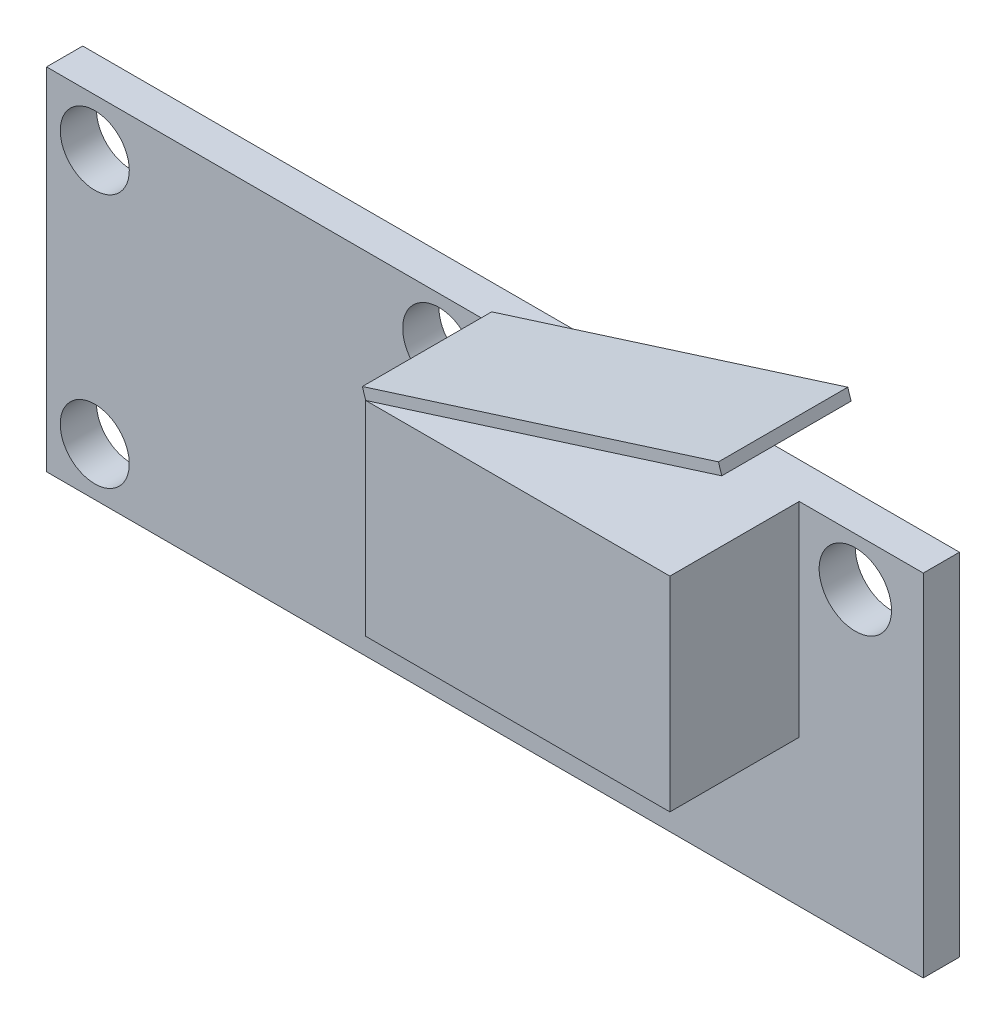
ISO-10303-21;
HEADER;
FILE_DESCRIPTION(('STEP AP214'),'2;1');
FILE_NAME('part.step','',(''),(''),'','','');
FILE_SCHEMA(('AUTOMOTIVE_DESIGN { 1 0 10303 214 1 1 1 1 }'));
ENDSEC;
DATA;
#1=APPLICATION_CONTEXT('core data for automotive mechanical design processes');
#2=APPLICATION_PROTOCOL_DEFINITION('international standard','automotive_design',2000,#1);
#3=PRODUCT_CONTEXT('',#1,'mechanical');
#4=PRODUCT('Part','Part','',(#3));
#5=PRODUCT_RELATED_PRODUCT_CATEGORY('part','',(#4));
#6=PRODUCT_DEFINITION_FORMATION('','',#4);
#7=PRODUCT_DEFINITION_CONTEXT('part definition',#1,'design');
#8=PRODUCT_DEFINITION('design','',#6,#7);
#9=PRODUCT_DEFINITION_SHAPE('','',#8);
#10=(LENGTH_UNIT() NAMED_UNIT(*) SI_UNIT(.MILLI.,.METRE.));
#11=(NAMED_UNIT(*) PLANE_ANGLE_UNIT() SI_UNIT($,.RADIAN.));
#12=(NAMED_UNIT(*) SI_UNIT($,.STERADIAN.) SOLID_ANGLE_UNIT());
#13=UNCERTAINTY_MEASURE_WITH_UNIT(LENGTH_MEASURE(1.E-05),#10,'distance_accuracy_value','');
#14=(GEOMETRIC_REPRESENTATION_CONTEXT(3) GLOBAL_UNCERTAINTY_ASSIGNED_CONTEXT((#13)) GLOBAL_UNIT_ASSIGNED_CONTEXT((#10,
#11,#12)) REPRESENTATION_CONTEXT('',''));
#15=CARTESIAN_POINT('',(0.,0.,0.));
#16=DIRECTION('',(0.,0.,1.));
#17=DIRECTION('',(1.,0.,0.));
#18=AXIS2_PLACEMENT_3D('',#15,#16,#17);
#19=CARTESIAN_POINT('',(20.4601752268349,16.,7.55));
#20=DIRECTION('',(-0.30191381405239,0.953335223771963,0.));
#21=DIRECTION('',(-0.953335223771963,-0.30191381405239,0.));
#22=AXIS2_PLACEMENT_3D('',#19,#20,#21);
#23=PLANE('',#22);
#24=DIRECTION('',(0.953335223771963,0.30191381405239,0.));
#25=VECTOR('',#24,1.);
#26=CARTESIAN_POINT('',(20.4601752268349,16.,1.65));
#27=LINE('',#26,#25);
#28=CARTESIAN_POINT('',(20.4601752268349,16.,1.65));
#29=VERTEX_POINT('',#28);
#30=CARTESIAN_POINT('',(36.706382378916,21.1450468238896,1.65));
#31=VERTEX_POINT('',#30);
#32=EDGE_CURVE('E106',#29,#31,#27,.T.);
#33=ORIENTED_EDGE('',*,*,#32,.T.);
#34=DIRECTION('',(0.,0.,-1.));
#35=VECTOR('',#34,1.);
#36=CARTESIAN_POINT('',(36.706382378916,21.1450468238896,7.55));
#37=LINE('',#36,#35);
#38=CARTESIAN_POINT('',(36.706382378916,21.1450468238896,7.55));
#39=VERTEX_POINT('',#38);
#40=EDGE_CURVE('E12',#39,#31,#37,.T.);
#41=ORIENTED_EDGE('',*,*,#40,.F.);
#42=DIRECTION('',(0.953335223771963,0.30191381405239,0.));
#43=VECTOR('',#42,1.);
#44=CARTESIAN_POINT('',(20.4601752268349,16.,7.55));
#45=LINE('',#44,#43);
#46=CARTESIAN_POINT('',(20.4601752268349,16.,7.55));
#47=VERTEX_POINT('',#46);
#48=EDGE_CURVE('E83',#47,#39,#45,.T.);
#49=ORIENTED_EDGE('',*,*,#48,.F.);
#50=DIRECTION('',(0.,0.,-1.));
#51=VECTOR('',#50,1.);
#52=CARTESIAN_POINT('',(20.4601752268349,16.,7.55));
#53=LINE('',#52,#51);
#54=EDGE_CURVE('E59',#47,#29,#53,.T.);
#55=ORIENTED_EDGE('',*,*,#54,.T.);
#56=EDGE_LOOP('',(#33,#41,#49,#55));
#57=FACE_BOUND('',#56,.T.);
#58=ADVANCED_FACE('F43',(#57),#23,.F.);
#59=CARTESIAN_POINT('',(36.5554254718899,21.6217144357756,7.55));
#60=DIRECTION('',(0.953335223771966,0.301913814052382,0.));
#61=DIRECTION('',(-0.301913814052382,0.953335223771966,0.));
#62=AXIS2_PLACEMENT_3D('',#59,#60,#61);
#63=PLANE('',#62);
#64=DIRECTION('',(0.301913814052382,-0.953335223771966,0.));
#65=VECTOR('',#64,1.);
#66=CARTESIAN_POINT('',(36.5554254718899,21.6217144357756,1.65));
#67=LINE('',#66,#65);
#68=CARTESIAN_POINT('',(36.5554254718899,21.6217144357756,1.65));
#69=VERTEX_POINT('',#68);
#70=EDGE_CURVE('E92',#69,#31,#67,.T.);
#71=ORIENTED_EDGE('',*,*,#70,.F.);
#72=DIRECTION('',(0.,0.,-1.));
#73=VECTOR('',#72,1.);
#74=CARTESIAN_POINT('',(36.5554254718899,21.6217144357756,7.55));
#75=LINE('',#74,#73);
#76=CARTESIAN_POINT('',(36.5554254718899,21.6217144357756,7.55));
#77=VERTEX_POINT('',#76);
#78=EDGE_CURVE('E51',#77,#69,#75,.T.);
#79=ORIENTED_EDGE('',*,*,#78,.F.);
#80=DIRECTION('',(0.301913814052382,-0.953335223771966,0.));
#81=VECTOR('',#80,1.);
#82=CARTESIAN_POINT('',(36.5554254718899,21.6217144357756,7.55));
#83=LINE('',#82,#81);
#84=EDGE_CURVE('E90',#77,#39,#83,.T.);
#85=ORIENTED_EDGE('',*,*,#84,.T.);
#86=ORIENTED_EDGE('',*,*,#40,.T.);
#87=EDGE_LOOP('',(#71,#79,#85,#86));
#88=FACE_BOUND('',#87,.T.);
#89=ADVANCED_FACE('F89',(#88),#63,.T.);
#90=CARTESIAN_POINT('',(20.3092183198087,16.476667611886,7.55));
#91=DIRECTION('',(-0.30191381405239,0.953335223771963,0.));
#92=DIRECTION('',(-0.953335223771963,-0.30191381405239,0.));
#93=AXIS2_PLACEMENT_3D('',#90,#91,#92);
#94=PLANE('',#93);
#95=DIRECTION('',(0.953335223771963,0.30191381405239,0.));
#96=VECTOR('',#95,1.);
#97=CARTESIAN_POINT('',(20.3092183198087,16.476667611886,1.65));
#98=LINE('',#97,#96);
#99=CARTESIAN_POINT('',(20.3092183198087,16.476667611886,1.65));
#100=VERTEX_POINT('',#99);
#101=EDGE_CURVE('E109',#100,#69,#98,.T.);
#102=ORIENTED_EDGE('',*,*,#101,.F.);
#103=DIRECTION('',(0.,0.,-1.));
#104=VECTOR('',#103,1.);
#105=CARTESIAN_POINT('',(20.3092183198087,16.476667611886,7.55));
#106=LINE('',#105,#104);
#107=CARTESIAN_POINT('',(20.3092183198087,16.476667611886,7.55));
#108=VERTEX_POINT('',#107);
#109=EDGE_CURVE('E72',#108,#100,#106,.T.);
#110=ORIENTED_EDGE('',*,*,#109,.F.);
#111=DIRECTION('',(0.953335223771963,0.30191381405239,0.));
#112=VECTOR('',#111,1.);
#113=CARTESIAN_POINT('',(20.3092183198087,16.476667611886,7.55));
#114=LINE('',#113,#112);
#115=EDGE_CURVE('E98',#108,#77,#114,.T.);
#116=ORIENTED_EDGE('',*,*,#115,.T.);
#117=ORIENTED_EDGE('',*,*,#78,.T.);
#118=EDGE_LOOP('',(#102,#110,#116,#117));
#119=FACE_BOUND('',#118,.T.);
#120=ADVANCED_FACE('F100',(#119),#94,.T.);
#121=CARTESIAN_POINT('',(20.4601752268349,16.,7.55));
#122=DIRECTION('',(-0.953335223771964,-0.301913814052388,0.));
#123=DIRECTION('',(0.301913814052388,-0.953335223771964,0.));
#124=AXIS2_PLACEMENT_3D('',#121,#122,#123);
#125=PLANE('',#124);
#126=DIRECTION('',(-0.301913814052388,0.953335223771964,0.));
#127=VECTOR('',#126,1.);
#128=CARTESIAN_POINT('',(20.4601752268349,16.,1.65));
#129=LINE('',#128,#127);
#130=EDGE_CURVE('E111',#29,#100,#129,.T.);
#131=ORIENTED_EDGE('',*,*,#130,.F.);
#132=ORIENTED_EDGE('',*,*,#54,.F.);
#133=DIRECTION('',(-0.301913814052388,0.953335223771964,0.));
#134=VECTOR('',#133,1.);
#135=CARTESIAN_POINT('',(20.4601752268349,16.,7.55));
#136=LINE('',#135,#134);
#137=EDGE_CURVE('E101',#47,#108,#136,.T.);
#138=ORIENTED_EDGE('',*,*,#137,.T.);
#139=ORIENTED_EDGE('',*,*,#109,.T.);
#140=EDGE_LOOP('',(#131,#132,#138,#139));
#141=FACE_BOUND('',#140,.T.);
#142=ADVANCED_FACE('F117',(#141),#125,.T.);
#143=CARTESIAN_POINT('',(0.,0.,7.55));
#144=DIRECTION('',(0.,0.,-1.));
#145=DIRECTION('',(-1.,0.,0.));
#146=AXIS2_PLACEMENT_3D('',#143,#144,#145);
#147=PLANE('',#146);
#148=ORIENTED_EDGE('',*,*,#48,.T.);
#149=ORIENTED_EDGE('',*,*,#84,.F.);
#150=ORIENTED_EDGE('',*,*,#115,.F.);
#151=ORIENTED_EDGE('',*,*,#137,.F.);
#152=EDGE_LOOP('',(#148,#149,#150,#151));
#153=FACE_BOUND('',#152,.T.);
#154=ADVANCED_FACE('F97',(#153),#147,.F.);
#155=CARTESIAN_POINT('',(0.,0.,1.65));
#156=DIRECTION('',(0.,0.,-1.));
#157=DIRECTION('',(-1.,0.,0.));
#158=AXIS2_PLACEMENT_3D('',#155,#156,#157);
#159=PLANE('',#158);
#160=ORIENTED_EDGE('',*,*,#32,.F.);
#161=ORIENTED_EDGE('',*,*,#130,.T.);
#162=ORIENTED_EDGE('',*,*,#101,.T.);
#163=ORIENTED_EDGE('',*,*,#70,.T.);
#164=EDGE_LOOP('',(#160,#161,#162,#163));
#165=FACE_BOUND('',#164,.T.);
#166=ADVANCED_FACE('F116',(#165),#159,.T.);
#167=CLOSED_SHELL('',(#58,#89,#120,#142,#154,#166));
#168=MANIFOLD_SOLID_BREP('B2',#167);
#169=CARTESIAN_POINT('',(0.,0.,1.65));
#170=DIRECTION('',(0.,0.,-1.));
#171=DIRECTION('',(-1.,0.,0.));
#172=AXIS2_PLACEMENT_3D('',#169,#170,#171);
#173=PLANE('',#172);
#174=CARTESIAN_POINT('',(2.2,2.2,1.65));
#175=DIRECTION('',(0.,0.,1.));
#176=DIRECTION('',(-1.,0.,0.));
#177=AXIS2_PLACEMENT_3D('',#174,#175,#176);
#178=CIRCLE('',#177,1.575);
#179=CARTESIAN_POINT('',(0.625000000000001,2.2,1.65));
#180=VERTEX_POINT('',#179);
#181=EDGE_CURVE('E257',#180,#180,#178,.T.);
#182=ORIENTED_EDGE('',*,*,#181,.F.);
#183=EDGE_LOOP('',(#182));
#184=FACE_BOUND('',#183,.T.);
#185=CARTESIAN_POINT('',(17.9,13.8,1.65));
#186=DIRECTION('',(0.,0.,1.));
#187=DIRECTION('',(1.,0.,0.));
#188=AXIS2_PLACEMENT_3D('',#185,#186,#187);
#189=CIRCLE('',#188,1.65);
#190=CARTESIAN_POINT('',(19.55,13.8,1.65));
#191=VERTEX_POINT('',#190);
#192=EDGE_CURVE('E272',#191,#191,#189,.T.);
#193=ORIENTED_EDGE('',*,*,#192,.F.);
#194=EDGE_LOOP('',(#193));
#195=FACE_BOUND('',#194,.T.);
#196=CARTESIAN_POINT('',(36.9,13.8,1.65));
#197=DIRECTION('',(0.,0.,1.));
#198=DIRECTION('',(1.,0.,0.));
#199=AXIS2_PLACEMENT_3D('',#196,#197,#198);
#200=CIRCLE('',#199,1.65);
#201=CARTESIAN_POINT('',(38.55,13.8,1.65));
#202=VERTEX_POINT('',#201);
#203=EDGE_CURVE('E278',#202,#202,#200,.T.);
#204=ORIENTED_EDGE('',*,*,#203,.F.);
#205=EDGE_LOOP('',(#204));
#206=FACE_BOUND('',#205,.T.);
#207=CARTESIAN_POINT('',(2.2,13.8,1.65));
#208=DIRECTION('',(0.,0.,1.));
#209=DIRECTION('',(1.,0.,0.));
#210=AXIS2_PLACEMENT_3D('',#207,#208,#209);
#211=CIRCLE('',#210,1.575);
#212=CARTESIAN_POINT('',(3.775,13.8,1.65));
#213=VERTEX_POINT('',#212);
#214=EDGE_CURVE('E266',#213,#213,#211,.T.);
#215=ORIENTED_EDGE('',*,*,#214,.F.);
#216=EDGE_LOOP('',(#215));
#217=FACE_BOUND('',#216,.T.);
#218=DIRECTION('',(0.,-1.,0.));
#219=VECTOR('',#218,1.);
#220=CARTESIAN_POINT('',(20.4601752268349,6.68254459838567,1.65));
#221=LINE('',#220,#219);
#222=CARTESIAN_POINT('',(20.4601752268349,16.,1.65));
#223=VERTEX_POINT('',#222);
#224=CARTESIAN_POINT('',(20.4601752268349,6.68254459838567,1.65));
#225=VERTEX_POINT('',#224);
#226=EDGE_CURVE('E189',#223,#225,#221,.T.);
#227=ORIENTED_EDGE('',*,*,#226,.F.);
#228=DIRECTION('',(-1.,0.,0.));
#229=VECTOR('',#228,1.);
#230=CARTESIAN_POINT('',(0.,16.,1.65));
#231=LINE('',#230,#229);
#232=CARTESIAN_POINT('',(0.,16.,1.65));
#233=VERTEX_POINT('',#232);
#234=EDGE_CURVE('E292',#223,#233,#231,.T.);
#235=ORIENTED_EDGE('',*,*,#234,.T.);
#236=DIRECTION('',(0.,-1.,0.));
#237=VECTOR('',#236,1.);
#238=CARTESIAN_POINT('',(0.,0.,1.65));
#239=LINE('',#238,#237);
#240=CARTESIAN_POINT('',(0.,0.,1.65));
#241=VERTEX_POINT('',#240);
#242=EDGE_CURVE('E284',#233,#241,#239,.T.);
#243=ORIENTED_EDGE('',*,*,#242,.T.);
#244=DIRECTION('',(1.,0.,0.));
#245=VECTOR('',#244,1.);
#246=CARTESIAN_POINT('',(0.,0.,1.65));
#247=LINE('',#246,#245);
#248=CARTESIAN_POINT('',(40.,0.,1.65));
#249=VERTEX_POINT('',#248);
#250=EDGE_CURVE('E287',#241,#249,#247,.T.);
#251=ORIENTED_EDGE('',*,*,#250,.T.);
#252=DIRECTION('',(0.,1.,0.));
#253=VECTOR('',#252,1.);
#254=CARTESIAN_POINT('',(40.,0.,1.65));
#255=LINE('',#254,#253);
#256=CARTESIAN_POINT('',(40.,16.,1.65));
#257=VERTEX_POINT('',#256);
#258=EDGE_CURVE('E290',#249,#257,#255,.T.);
#259=ORIENTED_EDGE('',*,*,#258,.T.);
#260=CARTESIAN_POINT('',(34.3398247731651,16.,1.65));
#261=VERTEX_POINT('',#260);
#262=EDGE_CURVE('E300',#257,#261,#231,.T.);
#263=ORIENTED_EDGE('',*,*,#262,.T.);
#264=DIRECTION('',(0.,1.,0.));
#265=VECTOR('',#264,1.);
#266=CARTESIAN_POINT('',(34.3398247731651,6.68254459838567,1.65));
#267=LINE('',#266,#265);
#268=CARTESIAN_POINT('',(34.3398247731651,6.68254459838567,1.65));
#269=VERTEX_POINT('',#268);
#270=EDGE_CURVE('E251',#269,#261,#267,.T.);
#271=ORIENTED_EDGE('',*,*,#270,.F.);
#272=DIRECTION('',(1.,0.,0.));
#273=VECTOR('',#272,1.);
#274=CARTESIAN_POINT('',(34.3398247731651,6.68254459838567,1.65));
#275=LINE('',#274,#273);
#276=EDGE_CURVE('E184',#225,#269,#275,.T.);
#277=ORIENTED_EDGE('',*,*,#276,.F.);
#278=EDGE_LOOP('',(#227,#235,#243,#251,#259,#263,#271,#277));
#279=FACE_BOUND('',#278,.T.);
#280=ADVANCED_FACE('F167',(#184,#195,#206,#217,#279),#173,.F.);
#281=CARTESIAN_POINT('',(0.,0.,0.));
#282=DIRECTION('',(0.,0.,-1.));
#283=DIRECTION('',(-1.,0.,0.));
#284=AXIS2_PLACEMENT_3D('',#281,#282,#283);
#285=PLANE('',#284);
#286=CARTESIAN_POINT('',(2.2,13.8,0.));
#287=DIRECTION('',(0.,0.,1.));
#288=DIRECTION('',(1.,0.,0.));
#289=AXIS2_PLACEMENT_3D('',#286,#287,#288);
#290=CIRCLE('',#289,1.575);
#291=CARTESIAN_POINT('',(3.775,13.8,0.));
#292=VERTEX_POINT('',#291);
#293=EDGE_CURVE('E264',#292,#292,#290,.T.);
#294=ORIENTED_EDGE('',*,*,#293,.T.);
#295=EDGE_LOOP('',(#294));
#296=FACE_BOUND('',#295,.T.);
#297=CARTESIAN_POINT('',(36.9,13.8,0.));
#298=DIRECTION('',(0.,0.,1.));
#299=DIRECTION('',(1.,0.,0.));
#300=AXIS2_PLACEMENT_3D('',#297,#298,#299);
#301=CIRCLE('',#300,1.65);
#302=CARTESIAN_POINT('',(38.55,13.8,0.));
#303=VERTEX_POINT('',#302);
#304=EDGE_CURVE('E275',#303,#303,#301,.T.);
#305=ORIENTED_EDGE('',*,*,#304,.T.);
#306=EDGE_LOOP('',(#305));
#307=FACE_BOUND('',#306,.T.);
#308=DIRECTION('',(0.,-1.,0.));
#309=VECTOR('',#308,1.);
#310=CARTESIAN_POINT('',(0.,0.,0.));
#311=LINE('',#310,#309);
#312=CARTESIAN_POINT('',(0.,16.,0.));
#313=VERTEX_POINT('',#312);
#314=CARTESIAN_POINT('',(0.,0.,0.));
#315=VERTEX_POINT('',#314);
#316=EDGE_CURVE('E281',#313,#315,#311,.T.);
#317=ORIENTED_EDGE('',*,*,#316,.F.);
#318=DIRECTION('',(-1.,0.,0.));
#319=VECTOR('',#318,1.);
#320=CARTESIAN_POINT('',(0.,16.,0.));
#321=LINE('',#320,#319);
#322=CARTESIAN_POINT('',(40.,16.,0.));
#323=VERTEX_POINT('',#322);
#324=EDGE_CURVE('E288',#323,#313,#321,.T.);
#325=ORIENTED_EDGE('',*,*,#324,.F.);
#326=DIRECTION('',(0.,1.,0.));
#327=VECTOR('',#326,1.);
#328=CARTESIAN_POINT('',(40.,0.,0.));
#329=LINE('',#328,#327);
#330=CARTESIAN_POINT('',(40.,0.,0.));
#331=VERTEX_POINT('',#330);
#332=EDGE_CURVE('E311',#331,#323,#329,.T.);
#333=ORIENTED_EDGE('',*,*,#332,.F.);
#334=DIRECTION('',(1.,0.,0.));
#335=VECTOR('',#334,1.);
#336=CARTESIAN_POINT('',(0.,0.,0.));
#337=LINE('',#336,#335);
#338=EDGE_CURVE('E312',#315,#331,#337,.T.);
#339=ORIENTED_EDGE('',*,*,#338,.F.);
#340=EDGE_LOOP('',(#317,#325,#333,#339));
#341=FACE_BOUND('',#340,.T.);
#342=CARTESIAN_POINT('',(17.9,13.8,0.));
#343=DIRECTION('',(0.,0.,1.));
#344=DIRECTION('',(1.,0.,0.));
#345=AXIS2_PLACEMENT_3D('',#342,#343,#344);
#346=CIRCLE('',#345,1.65);
#347=CARTESIAN_POINT('',(19.55,13.8,0.));
#348=VERTEX_POINT('',#347);
#349=EDGE_CURVE('E269',#348,#348,#346,.T.);
#350=ORIENTED_EDGE('',*,*,#349,.T.);
#351=EDGE_LOOP('',(#350));
#352=FACE_BOUND('',#351,.T.);
#353=CARTESIAN_POINT('',(2.2,2.2,0.));
#354=DIRECTION('',(0.,0.,1.));
#355=DIRECTION('',(-1.,0.,0.));
#356=AXIS2_PLACEMENT_3D('',#353,#354,#355);
#357=CIRCLE('',#356,1.575);
#358=CARTESIAN_POINT('',(0.625000000000001,2.2,0.));
#359=VERTEX_POINT('',#358);
#360=EDGE_CURVE('E254',#359,#359,#357,.T.);
#361=ORIENTED_EDGE('',*,*,#360,.T.);
#362=EDGE_LOOP('',(#361));
#363=FACE_BOUND('',#362,.T.);
#364=ADVANCED_FACE('F323',(#296,#307,#341,#352,#363),#285,.T.);
#365=CARTESIAN_POINT('',(0.,0.,1.65));
#366=DIRECTION('',(1.,0.,0.));
#367=DIRECTION('',(0.,1.,0.));
#368=AXIS2_PLACEMENT_3D('',#365,#366,#367);
#369=PLANE('',#368);
#370=ORIENTED_EDGE('',*,*,#316,.T.);
#371=DIRECTION('',(0.,0.,-1.));
#372=VECTOR('',#371,1.);
#373=CARTESIAN_POINT('',(0.,0.,1.65));
#374=LINE('',#373,#372);
#375=EDGE_CURVE('E41',#241,#315,#374,.T.);
#376=ORIENTED_EDGE('',*,*,#375,.F.);
#377=ORIENTED_EDGE('',*,*,#242,.F.);
#378=DIRECTION('',(0.,0.,-1.));
#379=VECTOR('',#378,1.);
#380=CARTESIAN_POINT('',(0.,16.,1.65));
#381=LINE('',#380,#379);
#382=EDGE_CURVE('E301',#233,#313,#381,.T.);
#383=ORIENTED_EDGE('',*,*,#382,.T.);
#384=EDGE_LOOP('',(#370,#376,#377,#383));
#385=FACE_BOUND('',#384,.T.);
#386=ADVANCED_FACE('F169',(#385),#369,.F.);
#387=CARTESIAN_POINT('',(0.,0.,1.65));
#388=DIRECTION('',(0.,1.,0.));
#389=DIRECTION('',(0.,0.,1.));
#390=AXIS2_PLACEMENT_3D('',#387,#388,#389);
#391=PLANE('',#390);
#392=ORIENTED_EDGE('',*,*,#338,.T.);
#393=DIRECTION('',(0.,0.,-1.));
#394=VECTOR('',#393,1.);
#395=CARTESIAN_POINT('',(40.,0.,1.65));
#396=LINE('',#395,#394);
#397=EDGE_CURVE('E176',#249,#331,#396,.T.);
#398=ORIENTED_EDGE('',*,*,#397,.F.);
#399=ORIENTED_EDGE('',*,*,#250,.F.);
#400=ORIENTED_EDGE('',*,*,#375,.T.);
#401=EDGE_LOOP('',(#392,#398,#399,#400));
#402=FACE_BOUND('',#401,.T.);
#403=ADVANCED_FACE('F326',(#402),#391,.F.);
#404=CARTESIAN_POINT('',(40.,0.,1.65));
#405=DIRECTION('',(-1.,0.,0.));
#406=DIRECTION('',(0.,-1.,0.));
#407=AXIS2_PLACEMENT_3D('',#404,#405,#406);
#408=PLANE('',#407);
#409=ORIENTED_EDGE('',*,*,#332,.T.);
#410=DIRECTION('',(0.,0.,-1.));
#411=VECTOR('',#410,1.);
#412=CARTESIAN_POINT('',(40.,16.,1.65));
#413=LINE('',#412,#411);
#414=EDGE_CURVE('E305',#257,#323,#413,.T.);
#415=ORIENTED_EDGE('',*,*,#414,.F.);
#416=ORIENTED_EDGE('',*,*,#258,.F.);
#417=ORIENTED_EDGE('',*,*,#397,.T.);
#418=EDGE_LOOP('',(#409,#415,#416,#417));
#419=FACE_BOUND('',#418,.T.);
#420=ADVANCED_FACE('F334',(#419),#408,.F.);
#421=CARTESIAN_POINT('',(0.,16.,1.65));
#422=DIRECTION('',(0.,-1.,0.));
#423=DIRECTION('',(0.,0.,-1.));
#424=AXIS2_PLACEMENT_3D('',#421,#422,#423);
#425=PLANE('',#424);
#426=ORIENTED_EDGE('',*,*,#324,.T.);
#427=ORIENTED_EDGE('',*,*,#382,.F.);
#428=ORIENTED_EDGE('',*,*,#234,.F.);
#429=DIRECTION('',(0.,0.,-1.));
#430=VECTOR('',#429,1.);
#431=CARTESIAN_POINT('',(20.4601752268349,16.,7.55));
#432=LINE('',#431,#430);
#433=CARTESIAN_POINT('',(20.4601752268349,16.,7.55));
#434=VERTEX_POINT('',#433);
#435=EDGE_CURVE('E340',#434,#223,#432,.T.);
#436=ORIENTED_EDGE('',*,*,#435,.F.);
#437=DIRECTION('',(-1.,0.,0.));
#438=VECTOR('',#437,1.);
#439=CARTESIAN_POINT('',(34.3398247731651,16.,7.55));
#440=LINE('',#439,#438);
#441=CARTESIAN_POINT('',(34.3398247731651,16.,7.55));
#442=VERTEX_POINT('',#441);
#443=EDGE_CURVE('E247',#442,#434,#440,.T.);
#444=ORIENTED_EDGE('',*,*,#443,.F.);
#445=DIRECTION('',(0.,0.,-1.));
#446=VECTOR('',#445,1.);
#447=CARTESIAN_POINT('',(34.3398247731651,16.,7.55));
#448=LINE('',#447,#446);
#449=EDGE_CURVE('E259',#442,#261,#448,.T.);
#450=ORIENTED_EDGE('',*,*,#449,.T.);
#451=ORIENTED_EDGE('',*,*,#262,.F.);
#452=ORIENTED_EDGE('',*,*,#414,.T.);
#453=EDGE_LOOP('',(#426,#427,#428,#436,#444,#450,#451,#452));
#454=FACE_BOUND('',#453,.T.);
#455=ADVANCED_FACE('F329',(#454),#425,.F.);
#456=CARTESIAN_POINT('',(36.9,13.8,1.65));
#457=DIRECTION('',(0.,0.,-1.));
#458=DIRECTION('',(-1.,0.,0.));
#459=AXIS2_PLACEMENT_3D('',#456,#457,#458);
#460=CYLINDRICAL_SURFACE('',#459,1.65);
#461=ORIENTED_EDGE('',*,*,#203,.T.);
#462=EDGE_LOOP('',(#461));
#463=FACE_BOUND('',#462,.T.);
#464=ORIENTED_EDGE('',*,*,#304,.F.);
#465=EDGE_LOOP('',(#464));
#466=FACE_BOUND('',#465,.T.);
#467=ADVANCED_FACE('F369',(#463,#466),#460,.F.);
#468=CARTESIAN_POINT('',(17.9,13.8,1.65));
#469=DIRECTION('',(0.,0.,-1.));
#470=DIRECTION('',(-1.,0.,0.));
#471=AXIS2_PLACEMENT_3D('',#468,#469,#470);
#472=CYLINDRICAL_SURFACE('',#471,1.65);
#473=ORIENTED_EDGE('',*,*,#192,.T.);
#474=EDGE_LOOP('',(#473));
#475=FACE_BOUND('',#474,.T.);
#476=ORIENTED_EDGE('',*,*,#349,.F.);
#477=EDGE_LOOP('',(#476));
#478=FACE_BOUND('',#477,.T.);
#479=ADVANCED_FACE('F415',(#475,#478),#472,.F.);
#480=CARTESIAN_POINT('',(2.2,13.8,1.65));
#481=DIRECTION('',(0.,0.,-1.));
#482=DIRECTION('',(-1.,0.,0.));
#483=AXIS2_PLACEMENT_3D('',#480,#481,#482);
#484=CYLINDRICAL_SURFACE('',#483,1.575);
#485=ORIENTED_EDGE('',*,*,#214,.T.);
#486=EDGE_LOOP('',(#485));
#487=FACE_BOUND('',#486,.T.);
#488=ORIENTED_EDGE('',*,*,#293,.F.);
#489=EDGE_LOOP('',(#488));
#490=FACE_BOUND('',#489,.T.);
#491=ADVANCED_FACE('F423',(#487,#490),#484,.F.);
#492=CARTESIAN_POINT('',(2.2,2.2,1.65));
#493=DIRECTION('',(0.,0.,-1.));
#494=DIRECTION('',(-1.,0.,0.));
#495=AXIS2_PLACEMENT_3D('',#492,#493,#494);
#496=CYLINDRICAL_SURFACE('',#495,1.575);
#497=ORIENTED_EDGE('',*,*,#181,.T.);
#498=EDGE_LOOP('',(#497));
#499=FACE_BOUND('',#498,.T.);
#500=ORIENTED_EDGE('',*,*,#360,.F.);
#501=EDGE_LOOP('',(#500));
#502=FACE_BOUND('',#501,.T.);
#503=ADVANCED_FACE('F431',(#499,#502),#496,.F.);
#504=CARTESIAN_POINT('',(20.4601752268349,6.68254459838567,7.55));
#505=DIRECTION('',(1.,0.,0.));
#506=DIRECTION('',(0.,0.,-1.));
#507=AXIS2_PLACEMENT_3D('',#504,#505,#506);
#508=PLANE('',#507);
#509=ORIENTED_EDGE('',*,*,#226,.T.);
#510=DIRECTION('',(0.,0.,-1.));
#511=VECTOR('',#510,1.);
#512=CARTESIAN_POINT('',(20.4601752268349,6.68254459838567,7.55));
#513=LINE('',#512,#511);
#514=CARTESIAN_POINT('',(20.4601752268349,6.68254459838567,7.55));
#515=VERTEX_POINT('',#514);
#516=EDGE_CURVE('E236',#515,#225,#513,.T.);
#517=ORIENTED_EDGE('',*,*,#516,.F.);
#518=DIRECTION('',(0.,-1.,0.));
#519=VECTOR('',#518,1.);
#520=CARTESIAN_POINT('',(20.4601752268349,6.68254459838567,7.55));
#521=LINE('',#520,#519);
#522=EDGE_CURVE('E242',#434,#515,#521,.T.);
#523=ORIENTED_EDGE('',*,*,#522,.F.);
#524=ORIENTED_EDGE('',*,*,#435,.T.);
#525=EDGE_LOOP('',(#509,#517,#523,#524));
#526=FACE_BOUND('',#525,.T.);
#527=ADVANCED_FACE('F253',(#526),#508,.F.);
#528=CARTESIAN_POINT('',(34.3398247731651,6.68254459838567,7.55));
#529=DIRECTION('',(0.,1.,0.));
#530=DIRECTION('',(0.,0.,1.));
#531=AXIS2_PLACEMENT_3D('',#528,#529,#530);
#532=PLANE('',#531);
#533=ORIENTED_EDGE('',*,*,#276,.T.);
#534=DIRECTION('',(0.,0.,-1.));
#535=VECTOR('',#534,1.);
#536=CARTESIAN_POINT('',(34.3398247731651,6.68254459838567,7.55));
#537=LINE('',#536,#535);
#538=CARTESIAN_POINT('',(34.3398247731651,6.68254459838567,7.55));
#539=VERTEX_POINT('',#538);
#540=EDGE_CURVE('E238',#539,#269,#537,.T.);
#541=ORIENTED_EDGE('',*,*,#540,.F.);
#542=DIRECTION('',(1.,0.,0.));
#543=VECTOR('',#542,1.);
#544=CARTESIAN_POINT('',(34.3398247731651,6.68254459838567,7.55));
#545=LINE('',#544,#543);
#546=EDGE_CURVE('E232',#515,#539,#545,.T.);
#547=ORIENTED_EDGE('',*,*,#546,.F.);
#548=ORIENTED_EDGE('',*,*,#516,.T.);
#549=EDGE_LOOP('',(#533,#541,#547,#548));
#550=FACE_BOUND('',#549,.T.);
#551=ADVANCED_FACE('F234',(#550),#532,.F.);
#552=CARTESIAN_POINT('',(34.3398247731651,6.68254459838567,7.55));
#553=DIRECTION('',(-1.,0.,0.));
#554=DIRECTION('',(0.,0.,1.));
#555=AXIS2_PLACEMENT_3D('',#552,#553,#554);
#556=PLANE('',#555);
#557=ORIENTED_EDGE('',*,*,#270,.T.);
#558=ORIENTED_EDGE('',*,*,#449,.F.);
#559=DIRECTION('',(0.,1.,0.));
#560=VECTOR('',#559,1.);
#561=CARTESIAN_POINT('',(34.3398247731651,6.68254459838567,7.55));
#562=LINE('',#561,#560);
#563=EDGE_CURVE('E241',#539,#442,#562,.T.);
#564=ORIENTED_EDGE('',*,*,#563,.F.);
#565=ORIENTED_EDGE('',*,*,#540,.T.);
#566=EDGE_LOOP('',(#557,#558,#564,#565));
#567=FACE_BOUND('',#566,.T.);
#568=ADVANCED_FACE('F338',(#567),#556,.F.);
#569=CARTESIAN_POINT('',(0.,0.,7.55));
#570=DIRECTION('',(0.,0.,1.));
#571=DIRECTION('',(1.,0.,0.));
#572=AXIS2_PLACEMENT_3D('',#569,#570,#571);
#573=PLANE('',#572);
#574=ORIENTED_EDGE('',*,*,#522,.T.);
#575=ORIENTED_EDGE('',*,*,#546,.T.);
#576=ORIENTED_EDGE('',*,*,#563,.T.);
#577=ORIENTED_EDGE('',*,*,#443,.T.);
#578=EDGE_LOOP('',(#574,#575,#576,#577));
#579=FACE_BOUND('',#578,.T.);
#580=ADVANCED_FACE('F245',(#579),#573,.T.);
#581=CLOSED_SHELL('',(#280,#364,#386,#403,#420,#455,#467,#479,#491,#503,#527,#551,#568,#580));
#582=MANIFOLD_SOLID_BREP('B6',#581);
#583=ADVANCED_BREP_SHAPE_REPRESENTATION('',(#18,#168,#582),#14);
#584=SHAPE_DEFINITION_REPRESENTATION(#9,#583);
ENDSEC;
END-ISO-10303-21;
